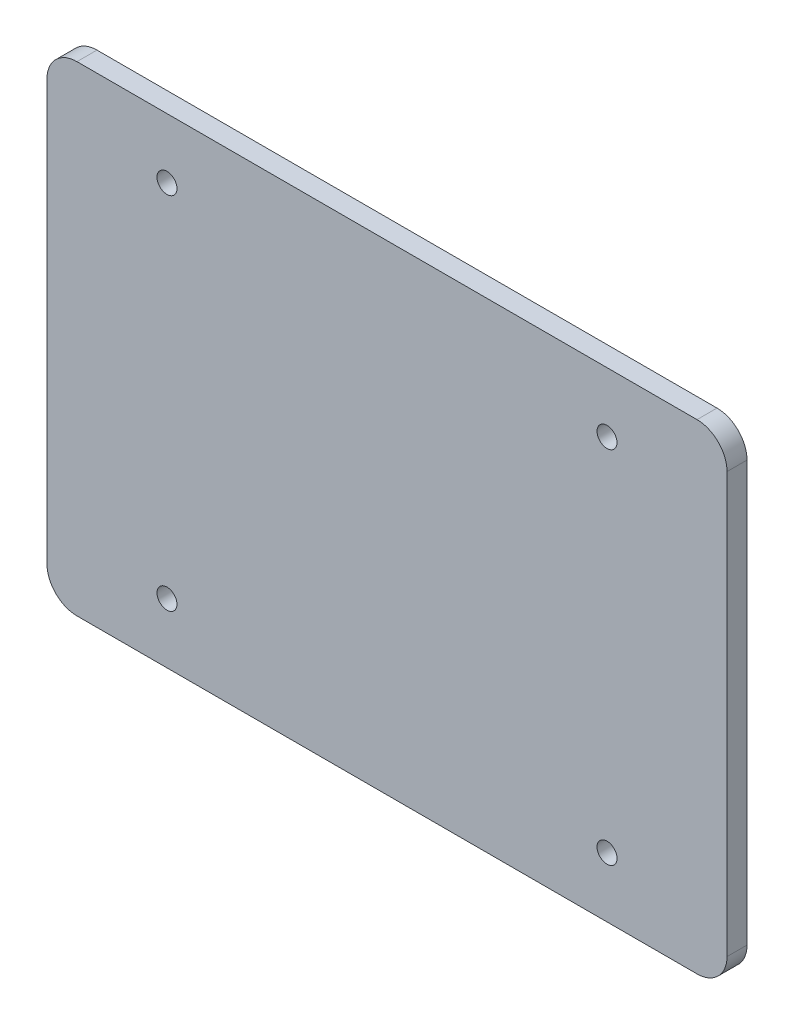
ISO-10303-21;
HEADER;
FILE_DESCRIPTION(('STEP AP214'),'2;1');
FILE_NAME('part.step','',(''),(''),'','','');
FILE_SCHEMA(('AUTOMOTIVE_DESIGN { 1 0 10303 214 1 1 1 1 }'));
ENDSEC;
DATA;
#1=APPLICATION_CONTEXT('core data for automotive mechanical design processes');
#2=APPLICATION_PROTOCOL_DEFINITION('international standard','automotive_design',2000,#1);
#3=PRODUCT_CONTEXT('',#1,'mechanical');
#4=PRODUCT('Part','Part','',(#3));
#5=PRODUCT_RELATED_PRODUCT_CATEGORY('part','',(#4));
#6=PRODUCT_DEFINITION_FORMATION('','',#4);
#7=PRODUCT_DEFINITION_CONTEXT('part definition',#1,'design');
#8=PRODUCT_DEFINITION('design','',#6,#7);
#9=PRODUCT_DEFINITION_SHAPE('','',#8);
#10=(LENGTH_UNIT() NAMED_UNIT(*) SI_UNIT(.MILLI.,.METRE.));
#11=(NAMED_UNIT(*) PLANE_ANGLE_UNIT() SI_UNIT($,.RADIAN.));
#12=(NAMED_UNIT(*) SI_UNIT($,.STERADIAN.) SOLID_ANGLE_UNIT());
#13=UNCERTAINTY_MEASURE_WITH_UNIT(LENGTH_MEASURE(1.E-05),#10,'distance_accuracy_value','');
#14=(GEOMETRIC_REPRESENTATION_CONTEXT(3) GLOBAL_UNCERTAINTY_ASSIGNED_CONTEXT((#13)) GLOBAL_UNIT_ASSIGNED_CONTEXT((#10,
#11,#12)) REPRESENTATION_CONTEXT('',''));
#15=CARTESIAN_POINT('',(0.,0.,0.));
#16=DIRECTION('',(0.,0.,1.));
#17=DIRECTION('',(1.,0.,0.));
#18=AXIS2_PLACEMENT_3D('',#15,#16,#17);
#19=CARTESIAN_POINT('',(0.,0.,10.));
#20=DIRECTION('',(0.,0.,1.));
#21=DIRECTION('',(1.,0.,0.));
#22=AXIS2_PLACEMENT_3D('',#19,#20,#21);
#23=PLANE('',#22);
#24=CARTESIAN_POINT('',(110.,90.,10.));
#25=DIRECTION('',(0.,0.,1.));
#26=DIRECTION('',(1.,0.,0.));
#27=AXIS2_PLACEMENT_3D('',#24,#25,#26);
#28=CIRCLE('',#27,5.00000000000001);
#29=CARTESIAN_POINT('',(115.,90.,10.));
#30=VERTEX_POINT('',#29);
#31=EDGE_CURVE('E195',#30,#30,#28,.T.);
#32=ORIENTED_EDGE('',*,*,#31,.F.);
#33=EDGE_LOOP('',(#32));
#34=FACE_BOUND('',#33,.T.);
#35=CARTESIAN_POINT('',(110.,-90.,10.));
#36=DIRECTION('',(0.,0.,-1.));
#37=DIRECTION('',(-1.,0.,0.));
#38=AXIS2_PLACEMENT_3D('',#35,#36,#37);
#39=CIRCLE('',#38,5.00000000000001);
#40=CARTESIAN_POINT('',(105.,-90.,10.));
#41=VERTEX_POINT('',#40);
#42=EDGE_CURVE('E371',#41,#41,#39,.T.);
#43=ORIENTED_EDGE('',*,*,#42,.T.);
#44=EDGE_LOOP('',(#43));
#45=FACE_BOUND('',#44,.T.);
#46=CARTESIAN_POINT('',(-110.,90.,10.));
#47=DIRECTION('',(0.,0.,1.));
#48=DIRECTION('',(1.,0.,0.));
#49=AXIS2_PLACEMENT_3D('',#46,#47,#48);
#50=CIRCLE('',#49,5.00000000000001);
#51=CARTESIAN_POINT('',(-105.,90.,10.));
#52=VERTEX_POINT('',#51);
#53=EDGE_CURVE('E190',#52,#52,#50,.T.);
#54=ORIENTED_EDGE('',*,*,#53,.F.);
#55=EDGE_LOOP('',(#54));
#56=FACE_BOUND('',#55,.T.);
#57=DIRECTION('',(0.,-1.,0.));
#58=VECTOR('',#57,1.);
#59=CARTESIAN_POINT('',(-170.,120.,10.));
#60=LINE('',#59,#58);
#61=CARTESIAN_POINT('',(-170.,105.,10.));
#62=VERTEX_POINT('',#61);
#63=CARTESIAN_POINT('',(-170.,-105.,10.));
#64=VERTEX_POINT('',#63);
#65=EDGE_CURVE('E130',#62,#64,#60,.T.);
#66=ORIENTED_EDGE('',*,*,#65,.T.);
#67=CARTESIAN_POINT('',(-155.,-105.,10.));
#68=DIRECTION('',(0.,0.,1.));
#69=DIRECTION('',(1.,0.,0.));
#70=AXIS2_PLACEMENT_3D('',#67,#68,#69);
#71=CIRCLE('',#70,15.);
#72=CARTESIAN_POINT('',(-155.,-120.,10.));
#73=VERTEX_POINT('',#72);
#74=EDGE_CURVE('E11',#64,#73,#71,.T.);
#75=ORIENTED_EDGE('',*,*,#74,.T.);
#76=DIRECTION('',(1.,0.,0.));
#77=VECTOR('',#76,1.);
#78=CARTESIAN_POINT('',(-170.,-120.,10.));
#79=LINE('',#78,#77);
#80=CARTESIAN_POINT('',(155.,-120.,10.));
#81=VERTEX_POINT('',#80);
#82=EDGE_CURVE('E131',#73,#81,#79,.T.);
#83=ORIENTED_EDGE('',*,*,#82,.T.);
#84=CARTESIAN_POINT('',(155.,-105.,10.));
#85=DIRECTION('',(0.,0.,1.));
#86=DIRECTION('',(1.,0.,0.));
#87=AXIS2_PLACEMENT_3D('',#84,#85,#86);
#88=CIRCLE('',#87,15.);
#89=CARTESIAN_POINT('',(170.,-105.,10.));
#90=VERTEX_POINT('',#89);
#91=EDGE_CURVE('E163',#81,#90,#88,.T.);
#92=ORIENTED_EDGE('',*,*,#91,.T.);
#93=DIRECTION('',(0.,1.,0.));
#94=VECTOR('',#93,1.);
#95=CARTESIAN_POINT('',(170.,120.,10.));
#96=LINE('',#95,#94);
#97=CARTESIAN_POINT('',(170.,105.,10.));
#98=VERTEX_POINT('',#97);
#99=EDGE_CURVE('E139',#90,#98,#96,.T.);
#100=ORIENTED_EDGE('',*,*,#99,.T.);
#101=CARTESIAN_POINT('',(155.,105.,10.));
#102=DIRECTION('',(0.,0.,1.));
#103=DIRECTION('',(1.,0.,0.));
#104=AXIS2_PLACEMENT_3D('',#101,#102,#103);
#105=CIRCLE('',#104,15.);
#106=CARTESIAN_POINT('',(155.,120.,10.));
#107=VERTEX_POINT('',#106);
#108=EDGE_CURVE('E152',#98,#107,#105,.T.);
#109=ORIENTED_EDGE('',*,*,#108,.T.);
#110=DIRECTION('',(-1.,0.,0.));
#111=VECTOR('',#110,1.);
#112=CARTESIAN_POINT('',(-170.,120.,10.));
#113=LINE('',#112,#111);
#114=CARTESIAN_POINT('',(-155.,120.,10.));
#115=VERTEX_POINT('',#114);
#116=EDGE_CURVE('E184',#107,#115,#113,.T.);
#117=ORIENTED_EDGE('',*,*,#116,.T.);
#118=CARTESIAN_POINT('',(-155.,105.,10.));
#119=DIRECTION('',(0.,0.,1.));
#120=DIRECTION('',(1.,0.,0.));
#121=AXIS2_PLACEMENT_3D('',#118,#119,#120);
#122=CIRCLE('',#121,15.);
#123=EDGE_CURVE('E123',#115,#62,#122,.T.);
#124=ORIENTED_EDGE('',*,*,#123,.T.);
#125=EDGE_LOOP('',(#66,#75,#83,#92,#100,#109,#117,#124));
#126=FACE_BOUND('',#125,.T.);
#127=CARTESIAN_POINT('',(-110.,-90.,10.));
#128=DIRECTION('',(0.,0.,-1.));
#129=DIRECTION('',(-1.,0.,0.));
#130=AXIS2_PLACEMENT_3D('',#127,#128,#129);
#131=CIRCLE('',#130,5.00000000000001);
#132=CARTESIAN_POINT('',(-115.,-90.,10.));
#133=VERTEX_POINT('',#132);
#134=EDGE_CURVE('E363',#133,#133,#131,.T.);
#135=ORIENTED_EDGE('',*,*,#134,.T.);
#136=EDGE_LOOP('',(#135));
#137=FACE_BOUND('',#136,.T.);
#138=ADVANCED_FACE('F48',(#34,#45,#56,#126,#137),#23,.T.);
#139=CARTESIAN_POINT('',(0.,0.,0.));
#140=DIRECTION('',(0.,0.,1.));
#141=DIRECTION('',(1.,0.,0.));
#142=AXIS2_PLACEMENT_3D('',#139,#140,#141);
#143=PLANE('',#142);
#144=CARTESIAN_POINT('',(110.,90.,0.));
#145=DIRECTION('',(0.,0.,1.));
#146=DIRECTION('',(1.,0.,0.));
#147=AXIS2_PLACEMENT_3D('',#144,#145,#146);
#148=CIRCLE('',#147,5.00000000000001);
#149=CARTESIAN_POINT('',(115.,90.,0.));
#150=VERTEX_POINT('',#149);
#151=EDGE_CURVE('E360',#150,#150,#148,.T.);
#152=ORIENTED_EDGE('',*,*,#151,.T.);
#153=EDGE_LOOP('',(#152));
#154=FACE_BOUND('',#153,.T.);
#155=CARTESIAN_POINT('',(-110.,90.,0.));
#156=DIRECTION('',(0.,0.,1.));
#157=DIRECTION('',(1.,0.,0.));
#158=AXIS2_PLACEMENT_3D('',#155,#156,#157);
#159=CIRCLE('',#158,5.00000000000001);
#160=CARTESIAN_POINT('',(-105.,90.,0.));
#161=VERTEX_POINT('',#160);
#162=EDGE_CURVE('E187',#161,#161,#159,.T.);
#163=ORIENTED_EDGE('',*,*,#162,.T.);
#164=EDGE_LOOP('',(#163));
#165=FACE_BOUND('',#164,.T.);
#166=DIRECTION('',(1.,0.,0.));
#167=VECTOR('',#166,1.);
#168=CARTESIAN_POINT('',(-170.,-120.,0.));
#169=LINE('',#168,#167);
#170=CARTESIAN_POINT('',(-155.,-120.,0.));
#171=VERTEX_POINT('',#170);
#172=CARTESIAN_POINT('',(155.,-120.,0.));
#173=VERTEX_POINT('',#172);
#174=EDGE_CURVE('E136',#171,#173,#169,.T.);
#175=ORIENTED_EDGE('',*,*,#174,.F.);
#176=CARTESIAN_POINT('',(-155.,-105.,0.));
#177=DIRECTION('',(0.,0.,1.));
#178=DIRECTION('',(1.,0.,0.));
#179=AXIS2_PLACEMENT_3D('',#176,#177,#178);
#180=CIRCLE('',#179,15.);
#181=CARTESIAN_POINT('',(-170.,-105.,0.));
#182=VERTEX_POINT('',#181);
#183=EDGE_CURVE('E56',#171,#182,#180,.F.);
#184=ORIENTED_EDGE('',*,*,#183,.T.);
#185=DIRECTION('',(0.,-1.,0.));
#186=VECTOR('',#185,1.);
#187=CARTESIAN_POINT('',(-170.,120.,0.));
#188=LINE('',#187,#186);
#189=CARTESIAN_POINT('',(-170.,105.,0.));
#190=VERTEX_POINT('',#189);
#191=EDGE_CURVE('E129',#190,#182,#188,.T.);
#192=ORIENTED_EDGE('',*,*,#191,.F.);
#193=CARTESIAN_POINT('',(-155.,105.,0.));
#194=DIRECTION('',(0.,0.,1.));
#195=DIRECTION('',(1.,0.,0.));
#196=AXIS2_PLACEMENT_3D('',#193,#194,#195);
#197=CIRCLE('',#196,15.);
#198=CARTESIAN_POINT('',(-155.,120.,0.));
#199=VERTEX_POINT('',#198);
#200=EDGE_CURVE('E111',#190,#199,#197,.F.);
#201=ORIENTED_EDGE('',*,*,#200,.T.);
#202=DIRECTION('',(-1.,0.,0.));
#203=VECTOR('',#202,1.);
#204=CARTESIAN_POINT('',(-170.,120.,0.));
#205=LINE('',#204,#203);
#206=CARTESIAN_POINT('',(155.,120.,0.));
#207=VERTEX_POINT('',#206);
#208=EDGE_CURVE('E137',#207,#199,#205,.T.);
#209=ORIENTED_EDGE('',*,*,#208,.F.);
#210=CARTESIAN_POINT('',(155.,105.,0.));
#211=DIRECTION('',(0.,0.,1.));
#212=DIRECTION('',(1.,0.,0.));
#213=AXIS2_PLACEMENT_3D('',#210,#211,#212);
#214=CIRCLE('',#213,15.);
#215=CARTESIAN_POINT('',(170.,105.,0.));
#216=VERTEX_POINT('',#215);
#217=EDGE_CURVE('E154',#207,#216,#214,.F.);
#218=ORIENTED_EDGE('',*,*,#217,.T.);
#219=DIRECTION('',(0.,1.,0.));
#220=VECTOR('',#219,1.);
#221=CARTESIAN_POINT('',(170.,120.,0.));
#222=LINE('',#221,#220);
#223=CARTESIAN_POINT('',(170.,-105.,0.));
#224=VERTEX_POINT('',#223);
#225=EDGE_CURVE('E141',#224,#216,#222,.T.);
#226=ORIENTED_EDGE('',*,*,#225,.F.);
#227=CARTESIAN_POINT('',(155.,-105.,0.));
#228=DIRECTION('',(0.,0.,1.));
#229=DIRECTION('',(1.,0.,0.));
#230=AXIS2_PLACEMENT_3D('',#227,#228,#229);
#231=CIRCLE('',#230,15.);
#232=EDGE_CURVE('E165',#224,#173,#231,.F.);
#233=ORIENTED_EDGE('',*,*,#232,.T.);
#234=EDGE_LOOP('',(#175,#184,#192,#201,#209,#218,#226,#233));
#235=FACE_BOUND('',#234,.T.);
#236=CARTESIAN_POINT('',(110.,-90.,0.));
#237=DIRECTION('',(0.,0.,-1.));
#238=DIRECTION('',(-1.,0.,0.));
#239=AXIS2_PLACEMENT_3D('',#236,#237,#238);
#240=CIRCLE('',#239,5.00000000000001);
#241=CARTESIAN_POINT('',(105.,-90.,0.));
#242=VERTEX_POINT('',#241);
#243=EDGE_CURVE('E366',#242,#242,#240,.T.);
#244=ORIENTED_EDGE('',*,*,#243,.F.);
#245=EDGE_LOOP('',(#244));
#246=FACE_BOUND('',#245,.T.);
#247=CARTESIAN_POINT('',(-110.,-90.,0.));
#248=DIRECTION('',(0.,0.,-1.));
#249=DIRECTION('',(-1.,0.,0.));
#250=AXIS2_PLACEMENT_3D('',#247,#248,#249);
#251=CIRCLE('',#250,5.00000000000001);
#252=CARTESIAN_POINT('',(-115.,-90.,0.));
#253=VERTEX_POINT('',#252);
#254=EDGE_CURVE('E198',#253,#253,#251,.T.);
#255=ORIENTED_EDGE('',*,*,#254,.F.);
#256=EDGE_LOOP('',(#255));
#257=FACE_BOUND('',#256,.T.);
#258=ADVANCED_FACE('F134',(#154,#165,#235,#246,#257),#143,.F.);
#259=CARTESIAN_POINT('',(-155.,-105.,10.));
#260=DIRECTION('',(0.,0.,1.));
#261=DIRECTION('',(1.,0.,0.));
#262=AXIS2_PLACEMENT_3D('',#259,#260,#261);
#263=CYLINDRICAL_SURFACE('',#262,15.);
#264=DIRECTION('',(0.,0.,1.));
#265=VECTOR('',#264,1.);
#266=CARTESIAN_POINT('',(-170.,-105.,10.));
#267=LINE('',#266,#265);
#268=EDGE_CURVE('E168',#182,#64,#267,.T.);
#269=ORIENTED_EDGE('',*,*,#268,.F.);
#270=ORIENTED_EDGE('',*,*,#183,.F.);
#271=DIRECTION('',(0.,0.,1.));
#272=VECTOR('',#271,1.);
#273=CARTESIAN_POINT('',(-155.,-120.,10.));
#274=LINE('',#273,#272);
#275=EDGE_CURVE('E170',#73,#171,#274,.F.);
#276=ORIENTED_EDGE('',*,*,#275,.F.);
#277=ORIENTED_EDGE('',*,*,#74,.F.);
#278=EDGE_LOOP('',(#269,#270,#276,#277));
#279=FACE_BOUND('',#278,.T.);
#280=ADVANCED_FACE('F50',(#279),#263,.T.);
#281=CARTESIAN_POINT('',(155.,-105.,10.));
#282=DIRECTION('',(0.,0.,-1.));
#283=DIRECTION('',(-1.,0.,0.));
#284=AXIS2_PLACEMENT_3D('',#281,#282,#283);
#285=CYLINDRICAL_SURFACE('',#284,15.);
#286=DIRECTION('',(0.,0.,-1.));
#287=VECTOR('',#286,1.);
#288=CARTESIAN_POINT('',(170.,-105.,10.));
#289=LINE('',#288,#287);
#290=EDGE_CURVE('E157',#90,#224,#289,.T.);
#291=ORIENTED_EDGE('',*,*,#290,.F.);
#292=ORIENTED_EDGE('',*,*,#91,.F.);
#293=DIRECTION('',(0.,0.,-1.));
#294=VECTOR('',#293,1.);
#295=CARTESIAN_POINT('',(155.,-120.,10.));
#296=LINE('',#295,#294);
#297=EDGE_CURVE('E160',#173,#81,#296,.F.);
#298=ORIENTED_EDGE('',*,*,#297,.F.);
#299=ORIENTED_EDGE('',*,*,#232,.F.);
#300=EDGE_LOOP('',(#291,#292,#298,#299));
#301=FACE_BOUND('',#300,.T.);
#302=ADVANCED_FACE('F179',(#301),#285,.T.);
#303=CARTESIAN_POINT('',(155.,105.,10.));
#304=DIRECTION('',(0.,0.,-1.));
#305=DIRECTION('',(-1.,0.,0.));
#306=AXIS2_PLACEMENT_3D('',#303,#304,#305);
#307=CYLINDRICAL_SURFACE('',#306,15.);
#308=DIRECTION('',(0.,0.,-1.));
#309=VECTOR('',#308,1.);
#310=CARTESIAN_POINT('',(155.,120.,10.));
#311=LINE('',#310,#309);
#312=EDGE_CURVE('E122',#107,#207,#311,.T.);
#313=ORIENTED_EDGE('',*,*,#312,.F.);
#314=ORIENTED_EDGE('',*,*,#108,.F.);
#315=DIRECTION('',(0.,0.,-1.));
#316=VECTOR('',#315,1.);
#317=CARTESIAN_POINT('',(170.,105.,10.));
#318=LINE('',#317,#316);
#319=EDGE_CURVE('E149',#216,#98,#318,.F.);
#320=ORIENTED_EDGE('',*,*,#319,.F.);
#321=ORIENTED_EDGE('',*,*,#217,.F.);
#322=EDGE_LOOP('',(#313,#314,#320,#321));
#323=FACE_BOUND('',#322,.T.);
#324=ADVANCED_FACE('F207',(#323),#307,.T.);
#325=CARTESIAN_POINT('',(-155.,105.,10.));
#326=DIRECTION('',(0.,0.,-1.));
#327=DIRECTION('',(-1.,0.,0.));
#328=AXIS2_PLACEMENT_3D('',#325,#326,#327);
#329=CYLINDRICAL_SURFACE('',#328,15.);
#330=DIRECTION('',(0.,0.,-1.));
#331=VECTOR('',#330,1.);
#332=CARTESIAN_POINT('',(-170.,105.,10.));
#333=LINE('',#332,#331);
#334=EDGE_CURVE('E115',#62,#190,#333,.T.);
#335=ORIENTED_EDGE('',*,*,#334,.F.);
#336=ORIENTED_EDGE('',*,*,#123,.F.);
#337=DIRECTION('',(0.,0.,-1.));
#338=VECTOR('',#337,1.);
#339=CARTESIAN_POINT('',(-155.,120.,10.));
#340=LINE('',#339,#338);
#341=EDGE_CURVE('E118',#199,#115,#340,.F.);
#342=ORIENTED_EDGE('',*,*,#341,.F.);
#343=ORIENTED_EDGE('',*,*,#200,.F.);
#344=EDGE_LOOP('',(#335,#336,#342,#343));
#345=FACE_BOUND('',#344,.T.);
#346=ADVANCED_FACE('F113',(#345),#329,.T.);
#347=CARTESIAN_POINT('',(170.,120.,10.));
#348=DIRECTION('',(-1.,0.,0.));
#349=DIRECTION('',(0.,-1.,0.));
#350=AXIS2_PLACEMENT_3D('',#347,#348,#349);
#351=PLANE('',#350);
#352=ORIENTED_EDGE('',*,*,#99,.F.);
#353=ORIENTED_EDGE('',*,*,#290,.T.);
#354=ORIENTED_EDGE('',*,*,#225,.T.);
#355=ORIENTED_EDGE('',*,*,#319,.T.);
#356=EDGE_LOOP('',(#352,#353,#354,#355));
#357=FACE_BOUND('',#356,.T.);
#358=ADVANCED_FACE('F208',(#357),#351,.F.);
#359=CARTESIAN_POINT('',(-170.,120.,10.));
#360=DIRECTION('',(0.,-1.,0.));
#361=DIRECTION('',(0.,0.,-1.));
#362=AXIS2_PLACEMENT_3D('',#359,#360,#361);
#363=PLANE('',#362);
#364=ORIENTED_EDGE('',*,*,#116,.F.);
#365=ORIENTED_EDGE('',*,*,#312,.T.);
#366=ORIENTED_EDGE('',*,*,#208,.T.);
#367=ORIENTED_EDGE('',*,*,#341,.T.);
#368=EDGE_LOOP('',(#364,#365,#366,#367));
#369=FACE_BOUND('',#368,.T.);
#370=ADVANCED_FACE('F204',(#369),#363,.F.);
#371=CARTESIAN_POINT('',(-170.,120.,10.));
#372=DIRECTION('',(1.,0.,0.));
#373=DIRECTION('',(0.,1.,0.));
#374=AXIS2_PLACEMENT_3D('',#371,#372,#373);
#375=PLANE('',#374);
#376=ORIENTED_EDGE('',*,*,#191,.T.);
#377=ORIENTED_EDGE('',*,*,#268,.T.);
#378=ORIENTED_EDGE('',*,*,#65,.F.);
#379=ORIENTED_EDGE('',*,*,#334,.T.);
#380=EDGE_LOOP('',(#376,#377,#378,#379));
#381=FACE_BOUND('',#380,.T.);
#382=ADVANCED_FACE('F127',(#381),#375,.F.);
#383=CARTESIAN_POINT('',(-170.,-120.,10.));
#384=DIRECTION('',(0.,1.,0.));
#385=DIRECTION('',(0.,0.,1.));
#386=AXIS2_PLACEMENT_3D('',#383,#384,#385);
#387=PLANE('',#386);
#388=ORIENTED_EDGE('',*,*,#82,.F.);
#389=ORIENTED_EDGE('',*,*,#275,.T.);
#390=ORIENTED_EDGE('',*,*,#174,.T.);
#391=ORIENTED_EDGE('',*,*,#297,.T.);
#392=EDGE_LOOP('',(#388,#389,#390,#391));
#393=FACE_BOUND('',#392,.T.);
#394=ADVANCED_FACE('F173',(#393),#387,.F.);
#395=CARTESIAN_POINT('',(-110.,90.,0.));
#396=DIRECTION('',(0.,0.,1.));
#397=DIRECTION('',(1.,0.,0.));
#398=AXIS2_PLACEMENT_3D('',#395,#396,#397);
#399=CYLINDRICAL_SURFACE('',#398,5.00000000000001);
#400=ORIENTED_EDGE('',*,*,#162,.F.);
#401=EDGE_LOOP('',(#400));
#402=FACE_BOUND('',#401,.T.);
#403=ORIENTED_EDGE('',*,*,#53,.T.);
#404=EDGE_LOOP('',(#403));
#405=FACE_BOUND('',#404,.T.);
#406=ADVANCED_FACE('F229',(#402,#405),#399,.F.);
#407=CARTESIAN_POINT('',(110.,-90.,0.));
#408=DIRECTION('',(0.,0.,1.));
#409=DIRECTION('',(1.,0.,0.));
#410=AXIS2_PLACEMENT_3D('',#407,#408,#409);
#411=CYLINDRICAL_SURFACE('',#410,5.00000000000001);
#412=ORIENTED_EDGE('',*,*,#243,.T.);
#413=EDGE_LOOP('',(#412));
#414=FACE_BOUND('',#413,.T.);
#415=ORIENTED_EDGE('',*,*,#42,.F.);
#416=EDGE_LOOP('',(#415));
#417=FACE_BOUND('',#416,.T.);
#418=ADVANCED_FACE('F326',(#414,#417),#411,.F.);
#419=CARTESIAN_POINT('',(-110.,-90.,0.));
#420=DIRECTION('',(0.,0.,1.));
#421=DIRECTION('',(1.,0.,0.));
#422=AXIS2_PLACEMENT_3D('',#419,#420,#421);
#423=CYLINDRICAL_SURFACE('',#422,5.00000000000001);
#424=ORIENTED_EDGE('',*,*,#254,.T.);
#425=EDGE_LOOP('',(#424));
#426=FACE_BOUND('',#425,.T.);
#427=ORIENTED_EDGE('',*,*,#134,.F.);
#428=EDGE_LOOP('',(#427));
#429=FACE_BOUND('',#428,.T.);
#430=ADVANCED_FACE('F335',(#426,#429),#423,.F.);
#431=CARTESIAN_POINT('',(110.,90.,0.));
#432=DIRECTION('',(0.,0.,1.));
#433=DIRECTION('',(1.,0.,0.));
#434=AXIS2_PLACEMENT_3D('',#431,#432,#433);
#435=CYLINDRICAL_SURFACE('',#434,5.00000000000001);
#436=ORIENTED_EDGE('',*,*,#151,.F.);
#437=EDGE_LOOP('',(#436));
#438=FACE_BOUND('',#437,.T.);
#439=ORIENTED_EDGE('',*,*,#31,.T.);
#440=EDGE_LOOP('',(#439));
#441=FACE_BOUND('',#440,.T.);
#442=ADVANCED_FACE('F345',(#438,#441),#435,.F.);
#443=CLOSED_SHELL('',(#138,#258,#280,#302,#324,#346,#358,#370,#382,#394,#406,#418,#430,#442));
#444=MANIFOLD_SOLID_BREP('B2',#443);
#445=ADVANCED_BREP_SHAPE_REPRESENTATION('',(#18,#444),#14);
#446=SHAPE_DEFINITION_REPRESENTATION(#9,#445);
ENDSEC;
END-ISO-10303-21;
